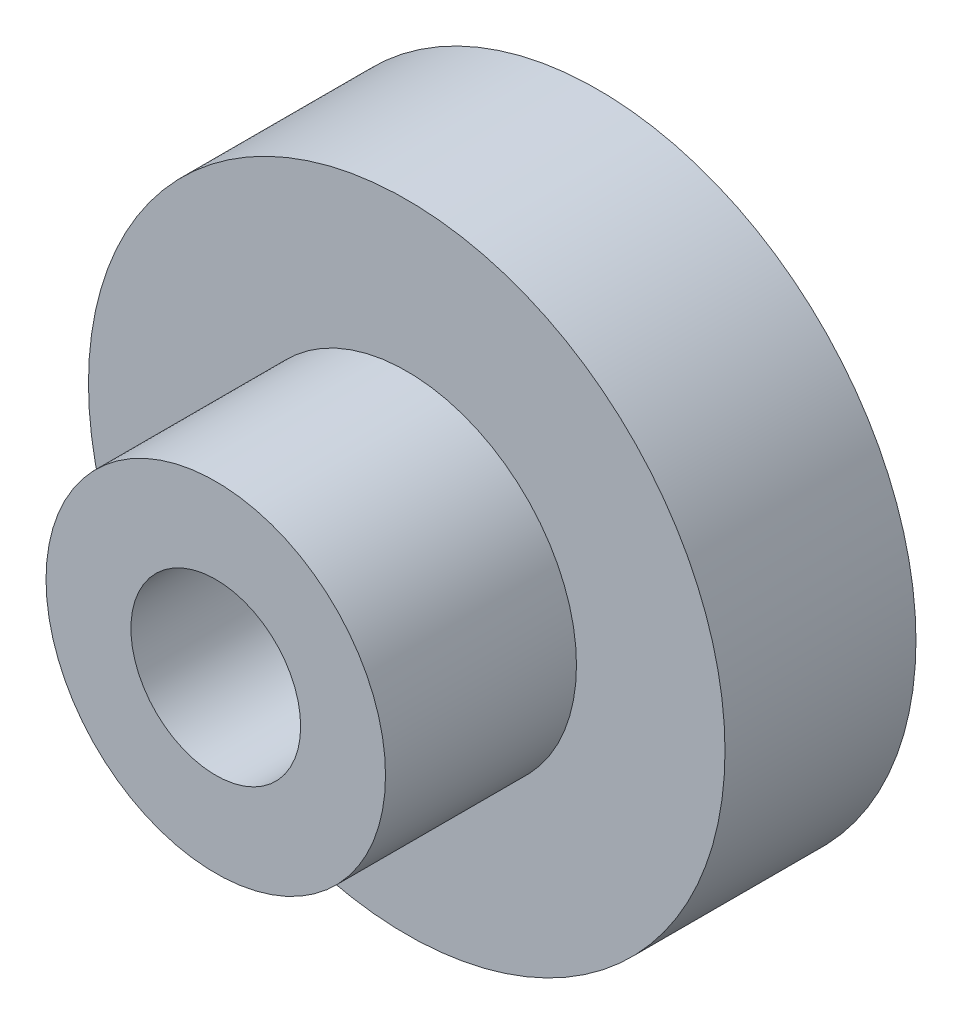
ISO-10303-21;
HEADER;
FILE_DESCRIPTION(('STEP AP214'),'2;1');
FILE_NAME('part.step','',(''),(''),'','','');
FILE_SCHEMA(('AUTOMOTIVE_DESIGN { 1 0 10303 214 1 1 1 1 }'));
ENDSEC;
DATA;
#1=APPLICATION_CONTEXT('core data for automotive mechanical design processes');
#2=APPLICATION_PROTOCOL_DEFINITION('international standard','automotive_design',2000,#1);
#3=PRODUCT_CONTEXT('',#1,'mechanical');
#4=PRODUCT('Part','Part','',(#3));
#5=PRODUCT_RELATED_PRODUCT_CATEGORY('part','',(#4));
#6=PRODUCT_DEFINITION_FORMATION('','',#4);
#7=PRODUCT_DEFINITION_CONTEXT('part definition',#1,'design');
#8=PRODUCT_DEFINITION('design','',#6,#7);
#9=PRODUCT_DEFINITION_SHAPE('','',#8);
#10=(LENGTH_UNIT() NAMED_UNIT(*) SI_UNIT(.MILLI.,.METRE.));
#11=(NAMED_UNIT(*) PLANE_ANGLE_UNIT() SI_UNIT($,.RADIAN.));
#12=(NAMED_UNIT(*) SI_UNIT($,.STERADIAN.) SOLID_ANGLE_UNIT());
#13=UNCERTAINTY_MEASURE_WITH_UNIT(LENGTH_MEASURE(1.E-05),#10,'distance_accuracy_value','');
#14=(GEOMETRIC_REPRESENTATION_CONTEXT(3) GLOBAL_UNCERTAINTY_ASSIGNED_CONTEXT((#13)) GLOBAL_UNIT_ASSIGNED_CONTEXT((#10,
#11,#12)) REPRESENTATION_CONTEXT('',''));
#15=CARTESIAN_POINT('',(0.,0.,0.));
#16=DIRECTION('',(0.,0.,1.));
#17=DIRECTION('',(1.,0.,0.));
#18=AXIS2_PLACEMENT_3D('',#15,#16,#17);
#19=CARTESIAN_POINT('',(0.,0.,9.));
#20=DIRECTION('',(0.,0.,1.));
#21=DIRECTION('',(1.,0.,0.));
#22=AXIS2_PLACEMENT_3D('',#19,#20,#21);
#23=PLANE('',#22);
#24=CARTESIAN_POINT('',(0.,0.,9.));
#25=DIRECTION('',(0.,0.,1.));
#26=DIRECTION('',(1.,0.,0.));
#27=AXIS2_PLACEMENT_3D('',#24,#25,#26);
#28=CIRCLE('',#27,15.);
#29=CARTESIAN_POINT('',(15.,0.,9.));
#30=VERTEX_POINT('',#29);
#31=EDGE_CURVE('E10',#30,#30,#28,.T.);
#32=ORIENTED_EDGE('',*,*,#31,.T.);
#33=EDGE_LOOP('',(#32));
#34=FACE_BOUND('',#33,.T.);
#35=CARTESIAN_POINT('',(0.,0.,9.));
#36=DIRECTION('',(0.,0.,1.));
#37=DIRECTION('',(1.,0.,0.));
#38=AXIS2_PLACEMENT_3D('',#35,#36,#37);
#39=CIRCLE('',#38,8.);
#40=CARTESIAN_POINT('',(8.,0.,9.));
#41=VERTEX_POINT('',#40);
#42=EDGE_CURVE('E50',#41,#41,#39,.T.);
#43=ORIENTED_EDGE('',*,*,#42,.F.);
#44=EDGE_LOOP('',(#43));
#45=FACE_BOUND('',#44,.T.);
#46=ADVANCED_FACE('F30',(#34,#45),#23,.T.);
#47=CARTESIAN_POINT('',(0.,0.,9.));
#48=DIRECTION('',(0.,0.,-1.));
#49=DIRECTION('',(-1.,0.,0.));
#50=AXIS2_PLACEMENT_3D('',#47,#48,#49);
#51=CYLINDRICAL_SURFACE('',#50,15.);
#52=CARTESIAN_POINT('',(0.,-15.,7.));
#53=CARTESIAN_POINT('',(0.1667307203779,-14.9999969274261,6.99999386650497));
#54=CARTESIAN_POINT('',(0.333538980604568,-14.9971915553469,6.98605347109706));
#55=CARTESIAN_POINT('',(0.662440523067059,-14.9862709686969,6.93070449965426));
#56=CARTESIAN_POINT('',(0.824529952624068,-14.9781515358056,6.88927410159547));
#57=CARTESIAN_POINT('',(1.13919091578994,-14.9575094783486,6.78027617913763));
#58=CARTESIAN_POINT('',(1.2917714037994,-14.9449910723015,6.71273368946594));
#59=CARTESIAN_POINT('',(1.58342396659268,-14.9169119410594,6.55350325746612));
#60=CARTESIAN_POINT('',(1.72249684522744,-14.9013513970712,6.46181675317838));
#61=CARTESIAN_POINT('',(1.9850804319446,-14.8686649598991,6.2555845171257));
#62=CARTESIAN_POINT('',(2.10838185347557,-14.8515223651304,6.14077493382639));
#63=CARTESIAN_POINT('',(2.33411026982408,-14.8177254135776,5.89212275082489));
#64=CARTESIAN_POINT('',(2.43653563431127,-14.8010710950127,5.75827866599464));
#65=CARTESIAN_POINT('',(2.61849526004286,-14.7699732543785,5.47385142096437));
#66=CARTESIAN_POINT('',(2.6978128165976,-14.7555512209484,5.32312706861092));
#67=CARTESIAN_POINT('',(2.82991699974092,-14.7307880417525,5.01015454298776));
#68=CARTESIAN_POINT('',(2.88270624731171,-14.7204464928588,4.84790750996097));
#69=CARTESIAN_POINT('',(2.95957589965448,-14.7051841575661,4.51874690827625));
#70=CARTESIAN_POINT('',(2.98402349387633,-14.7001941032156,4.35192236757332));
#71=CARTESIAN_POINT('',(3.00465638317836,-14.6959912518188,4.01647053590697));
#72=CARTESIAN_POINT('',(3.0008445681405,-14.6967778640352,3.84784343103956));
#73=CARTESIAN_POINT('',(2.96536371930546,-14.7039765344455,3.51625963593699));
#74=CARTESIAN_POINT('',(2.93411562073172,-14.7103035857629,3.35325578311806));
#75=CARTESIAN_POINT('',(2.84531365386915,-14.7277363848,3.03485177001099));
#76=CARTESIAN_POINT('',(2.78775852930204,-14.7388423607334,2.87945197324298));
#77=CARTESIAN_POINT('',(2.64757435102416,-14.7646685550122,2.5794542148892));
#78=CARTESIAN_POINT('',(2.56477845369634,-14.7794126944111,2.43493636129249));
#79=CARTESIAN_POINT('',(2.37658072371804,-14.8108385631919,2.16168745008156));
#80=CARTESIAN_POINT('',(2.27117629307049,-14.827520515151,2.03295820944653));
#81=CARTESIAN_POINT('',(2.03849980368175,-14.8613106372439,1.79251179262919));
#82=CARTESIAN_POINT('',(1.91086848363734,-14.8784210763271,1.68114229642261));
#83=CARTESIAN_POINT('',(1.63855507218603,-14.9108654614323,1.48133846109633));
#84=CARTESIAN_POINT('',(1.49387276213817,-14.9261993846692,1.39290441611926));
#85=CARTESIAN_POINT('',(1.19117816063676,-14.9534007048266,1.24141747232207));
#86=CARTESIAN_POINT('',(1.0331454587559,-14.9652626654482,1.17840431906639));
#87=CARTESIAN_POINT('',(0.708446929345995,-14.9841422696357,1.0799185778843));
#88=CARTESIAN_POINT('',(0.54178215021735,-14.9911605000159,1.04444265377912));
#89=CARTESIAN_POINT('',(0.207538216881453,-14.999480156006,1.00253063861717));
#90=CARTESIAN_POINT('',(0.0400209849767301,-15.0008752395741,0.995618741379194));
#91=CARTESIAN_POINT('',(-0.293774802578141,-14.9980515579031,1.00974957682654));
#92=CARTESIAN_POINT('',(-0.460053427331378,-14.9938331082434,1.03079073805779));
#93=CARTESIAN_POINT('',(-0.785116979839621,-14.9803149602405,1.09983512063187));
#94=CARTESIAN_POINT('',(-0.943955845019708,-14.9710612921262,1.14759420549371));
#95=CARTESIAN_POINT('',(-1.251370882499,-14.948506561831,1.26845194796743));
#96=CARTESIAN_POINT('',(-1.39994628491262,-14.9352051964268,1.34155250403049));
#97=CARTESIAN_POINT('',(-1.68462352105865,-14.9057973459988,1.51204747195394));
#98=CARTESIAN_POINT('',(-1.82055038025656,-14.8896585131116,1.60972834311684));
#99=CARTESIAN_POINT('',(-2.07425405735762,-14.8564420448965,1.82622757362184));
#100=CARTESIAN_POINT('',(-2.19202892679229,-14.8393643090516,1.9450481991996));
#101=CARTESIAN_POINT('',(-2.40792177232253,-14.8058791067089,2.20262005567337));
#102=CARTESIAN_POINT('',(-2.50571310734596,-14.7894858069991,2.34164723266401));
#103=CARTESIAN_POINT('',(-2.67655626015362,-14.7595257538858,2.63443408407004));
#104=CARTESIAN_POINT('',(-2.74960906776871,-14.7459588874003,2.78819316872066));
#105=CARTESIAN_POINT('',(-2.86845552474588,-14.7233022175315,3.10530473844864));
#106=CARTESIAN_POINT('',(-2.91439049937315,-14.7141892461656,3.26860252363096));
#107=CARTESIAN_POINT('',(-2.97812595488159,-14.7014231037608,3.60080036047271));
#108=CARTESIAN_POINT('',(-2.99593010467534,-14.6977692207333,3.76969967862804));
#109=CARTESIAN_POINT('',(-3.00276273260241,-14.6963744889414,4.10502659363295));
#110=CARTESIAN_POINT('',(-2.99230736421269,-14.698527575679,4.27144344678103));
#111=CARTESIAN_POINT('',(-2.94405691230018,-14.7082672045384,4.60009494971508));
#112=CARTESIAN_POINT('',(-2.90626204838789,-14.7158537030151,4.76232963308441));
#113=CARTESIAN_POINT('',(-2.80463570549686,-14.7355579265748,5.07768313372163));
#114=CARTESIAN_POINT('',(-2.74086752015203,-14.7476646305649,5.23082308150724));
#115=CARTESIAN_POINT('',(-2.58916393380481,-14.7750514492251,5.52431116220332));
#116=CARTESIAN_POINT('',(-2.50122650632465,-14.7903318299668,5.66465822117541));
#117=CARTESIAN_POINT('',(-2.30191774435924,-14.8226688156968,5.93114671645094));
#118=CARTESIAN_POINT('',(-2.19017366170554,-14.839751187291,6.05700629580279));
#119=CARTESIAN_POINT('',(-1.94719310703942,-14.8735824561586,6.28835861658751));
#120=CARTESIAN_POINT('',(-1.81595216146001,-14.8903312758955,6.39384667095182));
#121=CARTESIAN_POINT('',(-1.53605288726474,-14.9218149716391,6.58250393183934));
#122=CARTESIAN_POINT('',(-1.3872266532895,-14.9365269365774,6.66542800984008));
#123=CARTESIAN_POINT('',(-1.0774990828222,-14.96205375255,6.80495836778977));
#124=CARTESIAN_POINT('',(-0.916608782589379,-14.9728721141585,6.86158836859748));
#125=CARTESIAN_POINT('',(-0.629464466771339,-14.9872911778611,6.93595584413415));
#126=CARTESIAN_POINT('',(-0.504844992041353,-14.9920290947535,6.95992958112327));
#127=CARTESIAN_POINT('',(-0.2534985756302,-14.9983846241968,6.99195373707509));
#128=CARTESIAN_POINT('',(-0.126771701245856,-15.0000023361946,7.0000046635293));
#129=CARTESIAN_POINT('',(0.,-15.,7.));
#130=B_SPLINE_CURVE_WITH_KNOTS('',3,(#52,#53,#54,#55,#56,#57,#58,#59,#60,#61,#62,#63,#64,#65,
#66,#67,#68,#69,#70,#71,#72,#73,#74,#75,#76,#77,#78,#79,#80,#81,#82,#83,#84,#85,#86,#87,#88,#89,
#90,#91,#92,#93,#94,#95,#96,#97,#98,#99,#100,#101,#102,#103,#104,#105,#106,#107,#108,#109,#110,
#111,#112,#113,#114,#115,#116,#117,#118,#119,#120,#121,#122,#123,#124,#125,#126,#127,#128,#129),
.UNSPECIFIED.,.T.,.F.,(4,2,2,2,2,2,2,2,2,2,2,2,2,2,2,2,2,2,2,2,2,2,2,2,2,2,2,2,2,2,2,2,2,2,2,2,
2,2,4),(0.,0.499728391983775,0.99985395207397,1.49950120575103,1.99911870669259,
2.50479801033656,3.0105167902421,3.52083585017768,4.03110448095592,4.53468555310762,
5.03821512843675,5.53415181018835,6.03011217761189,6.52942470610778,7.02879464249011,
7.53714757474052,8.04550702619461,8.55465824562072,9.06374777094108,9.56432207028795,
10.064868229736,10.5609136185217,11.0569961764807,11.5591519810008,12.0613616503779,
12.5712188573768,13.081055661704,13.5882114309817,14.0953010499124,14.593191677031,
15.0910783047783,15.5877588375933,16.084481027456,16.5896422871743,17.0949196359879,
17.6054849002691,18.1155886655256,18.4955632586968,18.8755257411299),.UNSPECIFIED.);
#131=CARTESIAN_POINT('',(0.,-15.,7.));
#132=VERTEX_POINT('',#131);
#133=EDGE_CURVE('E61',#132,#132,#130,.T.);
#134=ORIENTED_EDGE('',*,*,#133,.T.);
#135=EDGE_LOOP('',(#134));
#136=FACE_BOUND('',#135,.T.);
#137=ORIENTED_EDGE('',*,*,#31,.F.);
#138=EDGE_LOOP('',(#137));
#139=FACE_BOUND('',#138,.T.);
#140=CARTESIAN_POINT('',(0.,0.,0.));
#141=DIRECTION('',(0.,0.,1.));
#142=DIRECTION('',(1.,0.,0.));
#143=AXIS2_PLACEMENT_3D('',#140,#141,#142);
#144=CIRCLE('',#143,15.);
#145=CARTESIAN_POINT('',(15.,0.,0.));
#146=VERTEX_POINT('',#145);
#147=EDGE_CURVE('E43',#146,#146,#144,.T.);
#148=ORIENTED_EDGE('',*,*,#147,.T.);
#149=EDGE_LOOP('',(#148));
#150=FACE_BOUND('',#149,.T.);
#151=ADVANCED_FACE('F32',(#136,#139,#150),#51,.T.);
#152=CARTESIAN_POINT('',(0.,0.,0.));
#153=DIRECTION('',(0.,0.,1.));
#154=DIRECTION('',(1.,0.,0.));
#155=AXIS2_PLACEMENT_3D('',#152,#153,#154);
#156=PLANE('',#155);
#157=CARTESIAN_POINT('',(0.,0.,0.));
#158=DIRECTION('',(0.,0.,1.));
#159=DIRECTION('',(1.,0.,0.));
#160=AXIS2_PLACEMENT_3D('',#157,#158,#159);
#161=CIRCLE('',#160,4.);
#162=CARTESIAN_POINT('',(4.,0.,0.));
#163=VERTEX_POINT('',#162);
#164=EDGE_CURVE('E53',#163,#163,#161,.T.);
#165=ORIENTED_EDGE('',*,*,#164,.T.);
#166=EDGE_LOOP('',(#165));
#167=FACE_BOUND('',#166,.T.);
#168=ORIENTED_EDGE('',*,*,#147,.F.);
#169=EDGE_LOOP('',(#168));
#170=FACE_BOUND('',#169,.T.);
#171=ADVANCED_FACE('F82',(#167,#170),#156,.F.);
#172=CARTESIAN_POINT('',(0.,0.,18.));
#173=DIRECTION('',(0.,0.,-1.));
#174=DIRECTION('',(-1.,0.,0.));
#175=AXIS2_PLACEMENT_3D('',#172,#173,#174);
#176=CYLINDRICAL_SURFACE('',#175,8.);
#177=CARTESIAN_POINT('',(0.,0.,18.));
#178=DIRECTION('',(0.,0.,1.));
#179=DIRECTION('',(1.,0.,0.));
#180=AXIS2_PLACEMENT_3D('',#177,#178,#179);
#181=CIRCLE('',#180,8.);
#182=CARTESIAN_POINT('',(8.,0.,18.));
#183=VERTEX_POINT('',#182);
#184=EDGE_CURVE('E48',#183,#183,#181,.T.);
#185=ORIENTED_EDGE('',*,*,#184,.F.);
#186=EDGE_LOOP('',(#185));
#187=FACE_BOUND('',#186,.T.);
#188=ORIENTED_EDGE('',*,*,#42,.T.);
#189=EDGE_LOOP('',(#188));
#190=FACE_BOUND('',#189,.T.);
#191=ADVANCED_FACE('F78',(#187,#190),#176,.T.);
#192=CARTESIAN_POINT('',(0.,0.,18.));
#193=DIRECTION('',(0.,0.,1.));
#194=DIRECTION('',(1.,0.,0.));
#195=AXIS2_PLACEMENT_3D('',#192,#193,#194);
#196=PLANE('',#195);
#197=CARTESIAN_POINT('',(0.,0.,18.));
#198=DIRECTION('',(0.,0.,1.));
#199=DIRECTION('',(1.,0.,0.));
#200=AXIS2_PLACEMENT_3D('',#197,#198,#199);
#201=CIRCLE('',#200,4.);
#202=CARTESIAN_POINT('',(4.,0.,18.));
#203=VERTEX_POINT('',#202);
#204=EDGE_CURVE('E58',#203,#203,#201,.T.);
#205=ORIENTED_EDGE('',*,*,#204,.F.);
#206=EDGE_LOOP('',(#205));
#207=FACE_BOUND('',#206,.T.);
#208=ORIENTED_EDGE('',*,*,#184,.T.);
#209=EDGE_LOOP('',(#208));
#210=FACE_BOUND('',#209,.T.);
#211=ADVANCED_FACE('F74',(#207,#210),#196,.T.);
#212=CARTESIAN_POINT('',(0.,0.,-10.));
#213=DIRECTION('',(0.,0.,1.));
#214=DIRECTION('',(1.,0.,0.));
#215=AXIS2_PLACEMENT_3D('',#212,#213,#214);
#216=CYLINDRICAL_SURFACE('',#215,4.);
#217=CARTESIAN_POINT('',(0.,-4.,7.));
#218=CARTESIAN_POINT('',(-0.0732613677680269,-3.99999929901188,6.99999925798103));
#219=CARTESIAN_POINT('',(-0.146542351053627,-3.99798060344642,6.99730949301313));
#220=CARTESIAN_POINT('',(-0.292508538993504,-3.98996245699389,6.986605139865));
#221=CARTESIAN_POINT('',(-0.365193360793216,-3.98396062416369,6.97858736549519));
#222=CARTESIAN_POINT('',(-0.581731406983921,-3.96012745087107,6.94666409397176));
#223=CARTESIAN_POINT('',(-0.723892660392384,-3.93646888013437,6.91488904200892));
#224=CARTESIAN_POINT('',(-0.998506639011301,-3.87591490407891,6.83257479242475));
#225=CARTESIAN_POINT('',(-1.13101263465653,-3.83910000314071,6.78214965161711));
#226=CARTESIAN_POINT('',(-1.38483526994092,-3.75501017021524,6.66491463306846));
#227=CARTESIAN_POINT('',(-1.50615516858413,-3.70773829853535,6.59810954841649));
#228=CARTESIAN_POINT('',(-1.74693213195157,-3.60099357013528,6.44347627477938));
#229=CARTESIAN_POINT('',(-1.86517631030519,-3.54079623314279,6.35427414872666));
#230=CARTESIAN_POINT('',(-2.08606449940779,-3.41533027981217,6.16099950415699));
#231=CARTESIAN_POINT('',(-2.18868391091458,-3.35005390635213,6.05690402755224));
#232=CARTESIAN_POINT('',(-2.33993228026195,-3.24492237261661,5.87946465589541));
#233=CARTESIAN_POINT('',(-2.39379458304144,-3.2052891581058,5.81036988759055));
#234=CARTESIAN_POINT('',(-2.49548358548255,-3.12676887933752,5.66741086917572));
#235=CARTESIAN_POINT('',(-2.54330846513547,-3.0878820430606,5.59354519094895));
#236=CARTESIAN_POINT('',(-2.63261178619331,-3.01210562553028,5.44122820511978));
#237=CARTESIAN_POINT('',(-2.67409784691838,-2.9752136814322,5.3627825620375));
#238=CARTESIAN_POINT('',(-2.75043132677141,-2.90479339731392,5.20129295245105));
#239=CARTESIAN_POINT('',(-2.78527982077503,-2.87126451310282,5.11824973328609));
#240=CARTESIAN_POINT('',(-2.85760090658949,-2.7995453278082,4.92103772457626));
#241=CARTESIAN_POINT('',(-2.89251037008408,-2.76315561923757,4.80523022606539));
#242=CARTESIAN_POINT('',(-2.94841656316142,-2.70343128888206,4.56720293686586));
#243=CARTESIAN_POINT('',(-2.96944514417498,-2.6800667983994,4.44499852566328));
#244=CARTESIAN_POINT('',(-2.99625559824299,-2.65007535494332,4.19563797552823));
#245=CARTESIAN_POINT('',(-3.00189887157292,-2.6436005765876,4.06844722671663));
#246=CARTESIAN_POINT('',(-2.99696449042943,-2.64919059245027,3.81476933777095));
#247=CARTESIAN_POINT('',(-2.9863810204854,-2.66126203341493,3.68828246620502));
#248=CARTESIAN_POINT('',(-2.95195473462658,-2.69935247502785,3.45361749594042));
#249=CARTESIAN_POINT('',(-2.92964971367057,-2.72374314386008,3.34492730986416));
#250=CARTESIAN_POINT('',(-2.87411343637384,-2.78228385423355,3.13312219055168));
#251=CARTESIAN_POINT('',(-2.84087167817736,-2.81644327194565,3.03001272738605));
#252=CARTESIAN_POINT('',(-2.74066127604793,-2.91483538729993,2.76748725431259));
#253=CARTESIAN_POINT('',(-2.6656029678939,-2.9845129831659,2.61319917411636));
#254=CARTESIAN_POINT('',(-2.49236046828095,-3.13066596252173,2.32160694484032));
#255=CARTESIAN_POINT('',(-2.39412008565051,-3.20715757761233,2.18434531948443));
#256=CARTESIAN_POINT('',(-2.17303208149636,-3.36103344637552,1.92449322124942));
#257=CARTESIAN_POINT('',(-2.04962751039984,-3.43839173465929,1.80235878676777));
#258=CARTESIAN_POINT('',(-1.78084504353984,-3.58496075956505,1.57947270590797));
#259=CARTESIAN_POINT('',(-1.63551010852546,-3.65418696517002,1.47868015947125));
#260=CARTESIAN_POINT('',(-1.3558041609579,-3.76559452155695,1.3200384015737));
#261=CARTESIAN_POINT('',(-1.2250797406269,-3.81041541916803,1.25763081142553));
#262=CARTESIAN_POINT('',(-0.952704346148674,-3.88745808807126,1.15155023921509));
#263=CARTESIAN_POINT('',(-0.811060281155402,-3.91968774910058,1.10786552362683));
#264=CARTESIAN_POINT('',(-0.519352465945109,-3.96891177371227,1.0414932735979));
#265=CARTESIAN_POINT('',(-0.369242566477488,-3.98581186314606,1.01893563974277));
#266=CARTESIAN_POINT('',(-0.0664024759297813,-4.00231766947939,0.996900807635554));
#267=CARTESIAN_POINT('',(0.0863265824213238,-4.0019306830649,0.997413871494445));
#268=CARTESIAN_POINT('',(0.373608422358569,-3.98485095596869,1.02022173055466));
#269=CARTESIAN_POINT('',(0.508444611327582,-3.96980177630784,1.04032104534229));
#270=CARTESIAN_POINT('',(0.772221384992233,-3.92702635972252,1.09794758845683));
#271=CARTESIAN_POINT('',(0.901160708783228,-3.89929742534594,1.1354785251602));
#272=CARTESIAN_POINT('',(1.15483339082488,-3.83199678428177,1.22777495167151));
#273=CARTESIAN_POINT('',(1.27925770587446,-3.79204165281684,1.28310194754994));
#274=CARTESIAN_POINT('',(1.51703769337244,-3.70333906113673,1.40834532621352));
#275=CARTESIAN_POINT('',(1.63039183139361,-3.65459038471486,1.47826372729878));
#276=CARTESIAN_POINT('',(1.86302046499997,-3.54238575945114,1.64356468161399));
#277=CARTESIAN_POINT('',(1.98012231440924,-3.47783324856,1.74124979477955));
#278=CARTESIAN_POINT('',(2.19745073328884,-3.34476768394493,1.95202480563463));
#279=CARTESIAN_POINT('',(2.29763880438282,-3.27624605925973,2.0651488146632));
#280=CARTESIAN_POINT('',(2.44323760962617,-3.16783641864784,2.25682983034246));
#281=CARTESIAN_POINT('',(2.49441207840987,-3.12757855224153,2.33085785820569));
#282=CARTESIAN_POINT('',(2.59024776181559,-3.04868523124073,2.48382672212754));
#283=CARTESIAN_POINT('',(2.63490658340165,-3.01005037642924,2.56276934808545));
#284=CARTESIAN_POINT('',(2.75840992843588,-2.89884735629487,2.80658286818788));
#285=CARTESIAN_POINT('',(2.8272286655462,-2.83062934493712,2.97902187615987));
#286=CARTESIAN_POINT('',(2.91232161832907,-2.74237306217228,3.27084623424538));
#287=CARTESIAN_POINT('',(2.93862206696069,-2.71391502535151,3.38478684049129));
#288=CARTESIAN_POINT('',(2.97782857114492,-2.67084233048459,3.61740951656559));
#289=CARTESIAN_POINT('',(2.99076452454843,-2.65619677881272,3.73608038337308));
#290=CARTESIAN_POINT('',(3.00230698654587,-2.64315167964507,3.97565919506086));
#291=CARTESIAN_POINT('',(3.00084075038308,-2.64483460597191,4.09657541445446));
#292=CARTESIAN_POINT('',(2.98353723231362,-2.66432917886907,4.33611414967831));
#293=CARTESIAN_POINT('',(2.96768140541027,-2.68216163855031,4.45473350382051));
#294=CARTESIAN_POINT('',(2.91787829237152,-2.73634639677126,4.71182557558509));
#295=CARTESIAN_POINT('',(2.88073715900693,-2.77589185811732,4.84897923464055));
#296=CARTESIAN_POINT('',(2.78938673066517,-2.8676615343469,5.11308486170697));
#297=CARTESIAN_POINT('',(2.73513432117033,-2.91991769887725,5.24001003191199));
#298=CARTESIAN_POINT('',(2.63161322454641,-3.01293440174582,5.44327247983479));
#299=CARTESIAN_POINT('',(2.58648316812388,-3.05189072454864,5.52261485629527));
#300=CARTESIAN_POINT('',(2.48962257782423,-3.13140535919094,5.67631472353271));
#301=CARTESIAN_POINT('',(2.43789239621906,-3.17196358545146,5.75067248003353));
#302=CARTESIAN_POINT('',(2.32800429973169,-3.25347248479455,5.8943554607104));
#303=CARTESIAN_POINT('',(2.26984095281447,-3.29442346245138,5.96367634876076));
#304=CARTESIAN_POINT('',(2.14725580217517,-3.3756032435117,6.0970201748663));
#305=CARTESIAN_POINT('',(2.08283369004462,-3.41583201121154,6.16104285155734));
#306=CARTESIAN_POINT('',(1.94728190281497,-3.49489651383712,6.28397333307725));
#307=CARTESIAN_POINT('',(1.87609990910415,-3.53371751668994,6.34283308136052));
#308=CARTESIAN_POINT('',(1.72767987087953,-3.60860502556332,6.45432975706268));
#309=CARTESIAN_POINT('',(1.65044310433565,-3.64467210969302,6.50696799179473));
#310=CARTESIAN_POINT('',(1.49030317410493,-3.71302541445825,6.60534194205476));
#311=CARTESIAN_POINT('',(1.40741018139534,-3.74531815238001,6.65108959643197));
#312=CARTESIAN_POINT('',(1.23634243548294,-3.8052164046783,6.73505671604334));
#313=CARTESIAN_POINT('',(1.14817043896908,-3.8328243370667,6.77328006650652));
#314=CARTESIAN_POINT('',(0.929739140257552,-3.89270294176923,6.85556269896704));
#315=CARTESIAN_POINT('',(0.79712303120202,-3.92219862865417,6.8955243628176));
#316=CARTESIAN_POINT('',(0.5256674635306,-3.96768259876897,6.95684487958927));
#317=CARTESIAN_POINT('',(0.386846538130225,-3.9837086019408,6.97825568678842));
#318=CARTESIAN_POINT('',(0.205928000583103,-3.994909382017,6.99320929862348));
#319=CARTESIAN_POINT('',(0.164816108820164,-3.99681576437034,6.99575310282095));
#320=CARTESIAN_POINT('',(0.0824715620593071,-3.99936137264782,6.99914879853168));
#321=CARTESIAN_POINT('',(0.0412388886906554,-4.00000039458683,7.00000041768314));
#322=CARTESIAN_POINT('',(0.,-4.,7.));
#323=B_SPLINE_CURVE_WITH_KNOTS('',3,(#217,#218,#219,#220,#221,#222,#223,#224,#225,#226,#227,
#228,#229,#230,#231,#232,#233,#234,#235,#236,#237,#238,#239,#240,#241,#242,#243,#244,#245,#246,
#247,#248,#249,#250,#251,#252,#253,#254,#255,#256,#257,#258,#259,#260,#261,#262,#263,#264,#265,
#266,#267,#268,#269,#270,#271,#272,#273,#274,#275,#276,#277,#278,#279,#280,#281,#282,#283,#284,
#285,#286,#287,#288,#289,#290,#291,#292,#293,#294,#295,#296,#297,#298,#299,#300,#301,#302,#303,
#304,#305,#306,#307,#308,#309,#310,#311,#312,#313,#314,#315,#316,#317,#318,#319,#320,#321,#322),
.UNSPECIFIED.,.T.,.F.,(4,2,2,2,2,2,2,2,2,2,2,2,2,2,2,2,2,2,2,2,2,2,2,2,2,2,2,2,2,2,2,2,2,2,2,2,
2,2,2,2,2,2,2,2,2,2,2,2,2,2,2,2,4),(0.,0.219733524191398,0.439598569068991,0.879847634771395,
1.31744766307167,1.75491979362349,2.2329036222735,2.71163236402816,2.99983518527188,
3.28812468015056,3.57606487508902,3.86395840178997,4.24151729125786,4.61820678456564,
4.99827867308497,5.37848680666402,5.71806472391401,6.05796967267263,6.61051355677803,
7.16441076781761,7.73224459942164,8.29898017053365,8.75205702078762,9.20484951352218,
9.6604080839978,10.1157743699921,10.5253506608997,10.9350141243761,11.3591357103334,
11.7833160002107,12.2783345622972,12.7744651003689,13.0698938265096,13.3654307846348,
13.9540907813181,14.3138420927746,14.6727868466003,15.033545541411,15.3947698355934,
15.8348522835191,16.2760525671149,16.5734564783343,16.8708445226935,17.1684856206864,
17.466141392762,17.7663250552984,18.0664455283282,18.3660398682404,18.6654791022959,
19.0884486476652,19.5102297424976,19.6338980344064,19.7575862294511),.UNSPECIFIED.);
#324=CARTESIAN_POINT('',(0.,-4.,7.));
#325=VERTEX_POINT('',#324);
#326=EDGE_CURVE('E35',#325,#325,#323,.T.);
#327=ORIENTED_EDGE('',*,*,#326,.T.);
#328=EDGE_LOOP('',(#327));
#329=FACE_BOUND('',#328,.T.);
#330=ORIENTED_EDGE('',*,*,#204,.T.);
#331=EDGE_LOOP('',(#330));
#332=FACE_BOUND('',#331,.T.);
#333=ORIENTED_EDGE('',*,*,#164,.F.);
#334=EDGE_LOOP('',(#333));
#335=FACE_BOUND('',#334,.T.);
#336=ADVANCED_FACE('F68',(#329,#332,#335),#216,.F.);
#337=CARTESIAN_POINT('',(0.,-28.,4.));
#338=DIRECTION('',(0.,1.,0.));
#339=DIRECTION('',(0.,0.,1.));
#340=AXIS2_PLACEMENT_3D('',#337,#338,#339);
#341=CYLINDRICAL_SURFACE('',#340,3.);
#342=ORIENTED_EDGE('',*,*,#326,.F.);
#343=EDGE_LOOP('',(#342));
#344=FACE_BOUND('',#343,.T.);
#345=ORIENTED_EDGE('',*,*,#133,.F.);
#346=EDGE_LOOP('',(#345));
#347=FACE_BOUND('',#346,.T.);
#348=ADVANCED_FACE('F65',(#344,#347),#341,.F.);
#349=CLOSED_SHELL('',(#46,#151,#171,#191,#211,#336,#348));
#350=MANIFOLD_SOLID_BREP('B2',#349);
#351=ADVANCED_BREP_SHAPE_REPRESENTATION('',(#18,#350),#14);
#352=SHAPE_DEFINITION_REPRESENTATION(#9,#351);
ENDSEC;
END-ISO-10303-21;
